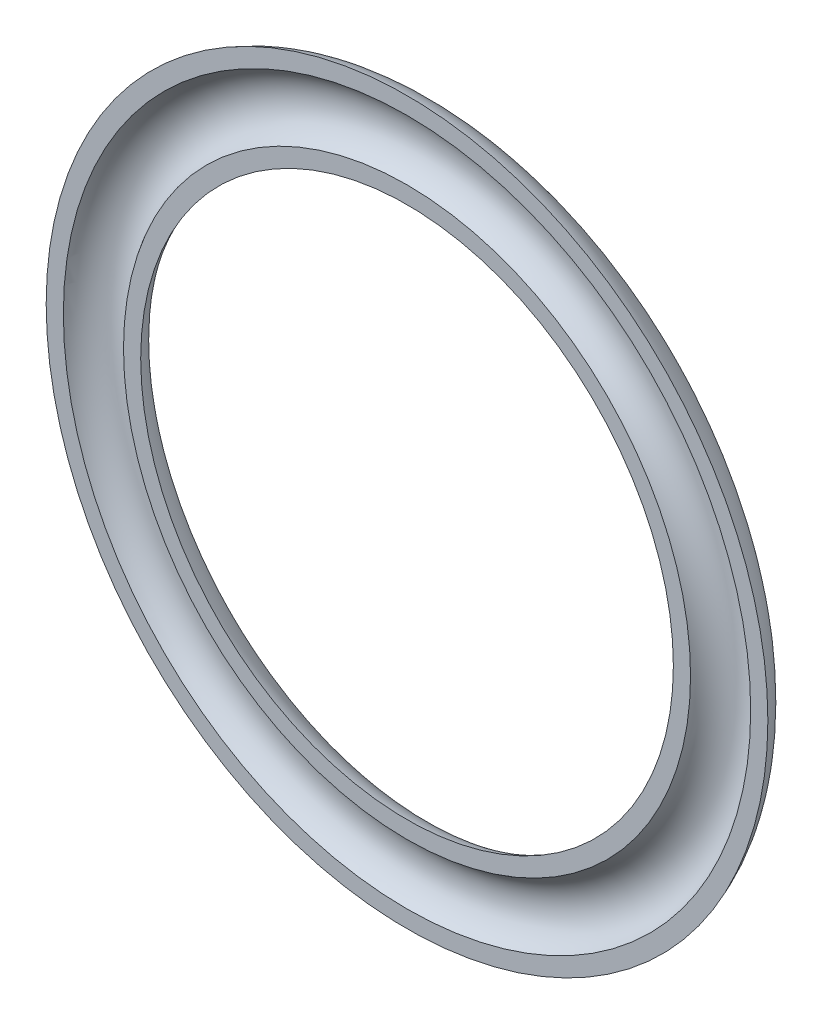
ISO-10303-21;
HEADER;
FILE_DESCRIPTION(('STEP AP214'),'2;1');
FILE_NAME('part.step','',(''),(''),'','','');
FILE_SCHEMA(('AUTOMOTIVE_DESIGN { 1 0 10303 214 1 1 1 1 }'));
ENDSEC;
DATA;
#1=APPLICATION_CONTEXT('core data for automotive mechanical design processes');
#2=APPLICATION_PROTOCOL_DEFINITION('international standard','automotive_design',2000,#1);
#3=PRODUCT_CONTEXT('',#1,'mechanical');
#4=PRODUCT('Part','Part','',(#3));
#5=PRODUCT_RELATED_PRODUCT_CATEGORY('part','',(#4));
#6=PRODUCT_DEFINITION_FORMATION('','',#4);
#7=PRODUCT_DEFINITION_CONTEXT('part definition',#1,'design');
#8=PRODUCT_DEFINITION('design','',#6,#7);
#9=PRODUCT_DEFINITION_SHAPE('','',#8);
#10=(LENGTH_UNIT() NAMED_UNIT(*) SI_UNIT(.MILLI.,.METRE.));
#11=(NAMED_UNIT(*) PLANE_ANGLE_UNIT() SI_UNIT($,.RADIAN.));
#12=(NAMED_UNIT(*) SI_UNIT($,.STERADIAN.) SOLID_ANGLE_UNIT());
#13=UNCERTAINTY_MEASURE_WITH_UNIT(LENGTH_MEASURE(1.E-05),#10,'distance_accuracy_value','');
#14=(GEOMETRIC_REPRESENTATION_CONTEXT(3) GLOBAL_UNCERTAINTY_ASSIGNED_CONTEXT((#13)) GLOBAL_UNIT_ASSIGNED_CONTEXT((#10,
#11,#12)) REPRESENTATION_CONTEXT('',''));
#15=CARTESIAN_POINT('',(0.,0.,0.));
#16=DIRECTION('',(0.,0.,1.));
#17=DIRECTION('',(1.,0.,0.));
#18=AXIS2_PLACEMENT_3D('',#15,#16,#17);
#19=CARTESIAN_POINT('',(0.,0.,0.859642895347843));
#20=DIRECTION('',(0.,0.,1.));
#21=DIRECTION('',(1.,0.,0.));
#22=AXIS2_PLACEMENT_3D('',#19,#20,#21);
#23=TOROIDAL_SURFACE('',#22,18.25,1.94973995894888);
#24=CARTESIAN_POINT('',(0.,0.,0.));
#25=DIRECTION('',(0.,0.,-1.));
#26=DIRECTION('',(-1.,0.,0.));
#27=AXIS2_PLACEMENT_3D('',#24,#25,#26);
#28=CIRCLE('',#27,16.5);
#29=CARTESIAN_POINT('',(-16.5,0.,0.));
#30=VERTEX_POINT('',#29);
#31=EDGE_CURVE('E55',#30,#30,#28,.F.);
#32=ORIENTED_EDGE('',*,*,#31,.F.);
#33=EDGE_LOOP('',(#32));
#34=FACE_BOUND('',#33,.T.);
#35=CARTESIAN_POINT('',(0.,0.,0.));
#36=DIRECTION('',(0.,0.,1.));
#37=DIRECTION('',(1.,0.,0.));
#38=AXIS2_PLACEMENT_3D('',#35,#36,#37);
#39=CIRCLE('',#38,20.);
#40=CARTESIAN_POINT('',(20.,0.,0.));
#41=VERTEX_POINT('',#40);
#42=EDGE_CURVE('E48',#41,#41,#39,.F.);
#43=ORIENTED_EDGE('',*,*,#42,.F.);
#44=EDGE_LOOP('',(#43));
#45=FACE_BOUND('',#44,.T.);
#46=ADVANCED_FACE('F40',(#34,#45),#23,.F.);
#47=CARTESIAN_POINT('',(0.,0.,0.));
#48=DIRECTION('',(0.,0.,1.));
#49=DIRECTION('',(1.,0.,0.));
#50=AXIS2_PLACEMENT_3D('',#47,#48,#49);
#51=PLANE('',#50);
#52=ORIENTED_EDGE('',*,*,#31,.T.);
#53=EDGE_LOOP('',(#52));
#54=FACE_BOUND('',#53,.T.);
#55=CARTESIAN_POINT('',(0.,0.,0.));
#56=DIRECTION('',(0.,0.,-1.));
#57=DIRECTION('',(-1.,0.,0.));
#58=AXIS2_PLACEMENT_3D('',#55,#56,#57);
#59=CIRCLE('',#58,15.5);
#60=CARTESIAN_POINT('',(-15.5,0.,0.));
#61=VERTEX_POINT('',#60);
#62=EDGE_CURVE('E10',#61,#61,#59,.T.);
#63=ORIENTED_EDGE('',*,*,#62,.T.);
#64=EDGE_LOOP('',(#63));
#65=FACE_BOUND('',#64,.T.);
#66=ADVANCED_FACE('F72',(#54,#65),#51,.T.);
#67=CARTESIAN_POINT('',(0.,0.,0.));
#68=DIRECTION('',(0.,0.,1.));
#69=DIRECTION('',(1.,0.,0.));
#70=AXIS2_PLACEMENT_3D('',#67,#68,#69);
#71=CIRCLE('',#70,21.);
#72=CARTESIAN_POINT('',(21.,0.,0.));
#73=VERTEX_POINT('',#72);
#74=EDGE_CURVE('E59',#73,#73,#71,.T.);
#75=ORIENTED_EDGE('',*,*,#74,.T.);
#76=EDGE_LOOP('',(#75));
#77=FACE_BOUND('',#76,.T.);
#78=ORIENTED_EDGE('',*,*,#42,.T.);
#79=EDGE_LOOP('',(#78));
#80=FACE_BOUND('',#79,.T.);
#81=ADVANCED_FACE('F65',(#77,#80),#51,.T.);
#82=CARTESIAN_POINT('',(0.,0.,0.859642895347843));
#83=DIRECTION('',(0.,0.,1.));
#84=DIRECTION('',(1.,0.,0.));
#85=AXIS2_PLACEMENT_3D('',#82,#83,#84);
#86=TOROIDAL_SURFACE('',#85,18.25,2.88122992965192);
#87=ORIENTED_EDGE('',*,*,#74,.F.);
#88=EDGE_LOOP('',(#87));
#89=FACE_BOUND('',#88,.T.);
#90=ORIENTED_EDGE('',*,*,#62,.F.);
#91=EDGE_LOOP('',(#90));
#92=FACE_BOUND('',#91,.T.);
#93=ADVANCED_FACE('F42',(#89,#92),#86,.T.);
#94=CLOSED_SHELL('',(#46,#66,#81,#93));
#95=MANIFOLD_SOLID_BREP('B2',#94);
#96=ADVANCED_BREP_SHAPE_REPRESENTATION('',(#18,#95),#14);
#97=SHAPE_DEFINITION_REPRESENTATION(#9,#96);
ENDSEC;
END-ISO-10303-21;
